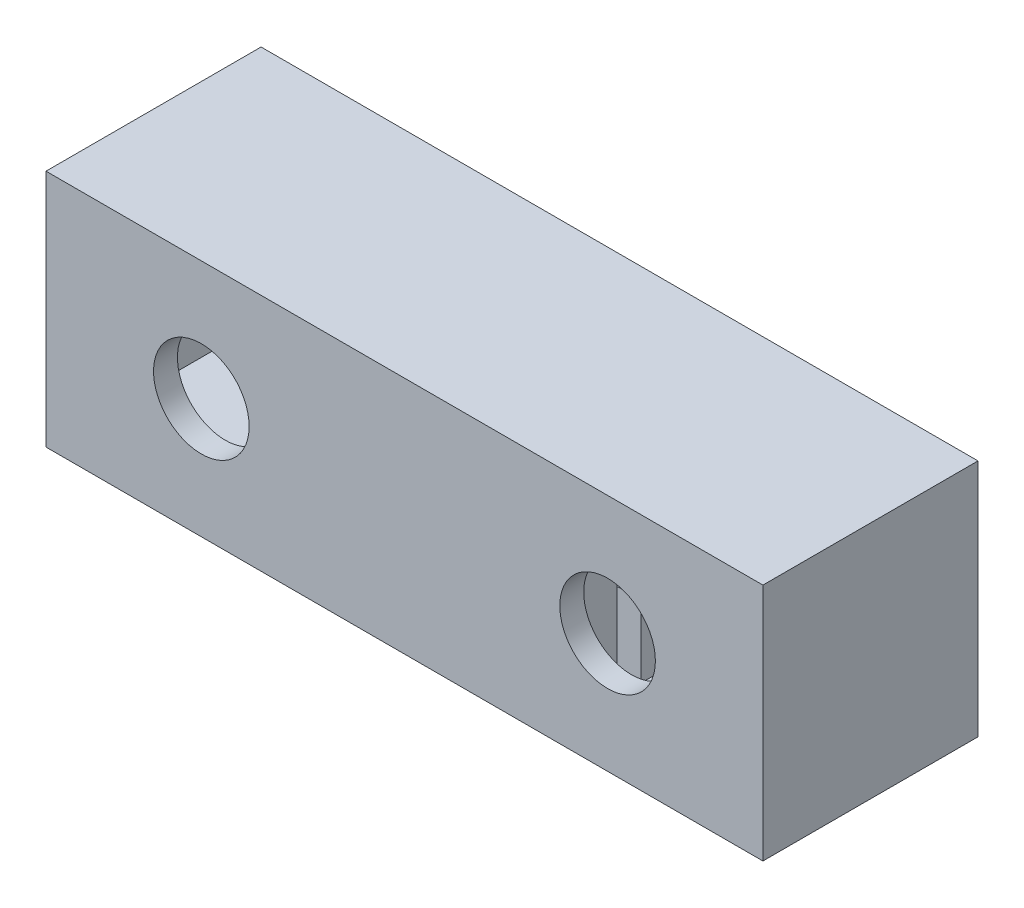
ISO-10303-21;
HEADER;
FILE_DESCRIPTION(('STEP AP214'),'2;1');
FILE_NAME('part.step','',(''),(''),'','','');
FILE_SCHEMA(('AUTOMOTIVE_DESIGN { 1 0 10303 214 1 1 1 1 }'));
ENDSEC;
DATA;
#1=APPLICATION_CONTEXT('core data for automotive mechanical design processes');
#2=APPLICATION_PROTOCOL_DEFINITION('international standard','automotive_design',2000,#1);
#3=PRODUCT_CONTEXT('',#1,'mechanical');
#4=PRODUCT('Part','Part','',(#3));
#5=PRODUCT_RELATED_PRODUCT_CATEGORY('part','',(#4));
#6=PRODUCT_DEFINITION_FORMATION('','',#4);
#7=PRODUCT_DEFINITION_CONTEXT('part definition',#1,'design');
#8=PRODUCT_DEFINITION('design','',#6,#7);
#9=PRODUCT_DEFINITION_SHAPE('','',#8);
#10=(LENGTH_UNIT() NAMED_UNIT(*) SI_UNIT(.MILLI.,.METRE.));
#11=(NAMED_UNIT(*) PLANE_ANGLE_UNIT() SI_UNIT($,.RADIAN.));
#12=(NAMED_UNIT(*) SI_UNIT($,.STERADIAN.) SOLID_ANGLE_UNIT());
#13=UNCERTAINTY_MEASURE_WITH_UNIT(LENGTH_MEASURE(1.E-05),#10,'distance_accuracy_value','');
#14=(GEOMETRIC_REPRESENTATION_CONTEXT(3) GLOBAL_UNCERTAINTY_ASSIGNED_CONTEXT((#13)) GLOBAL_UNIT_ASSIGNED_CONTEXT((#10,
#11,#12)) REPRESENTATION_CONTEXT('',''));
#15=CARTESIAN_POINT('',(0.,0.,0.));
#16=DIRECTION('',(0.,0.,1.));
#17=DIRECTION('',(1.,0.,0.));
#18=AXIS2_PLACEMENT_3D('',#15,#16,#17);
#19=CARTESIAN_POINT('',(0.,0.,-50.));
#20=DIRECTION('',(0.,0.,1.));
#21=DIRECTION('',(1.,0.,0.));
#22=AXIS2_PLACEMENT_3D('',#19,#20,#21);
#23=PLANE('',#22);
#24=DIRECTION('',(0.,1.,0.));
#25=VECTOR('',#24,1.);
#26=CARTESIAN_POINT('',(70.,-10.,-50.));
#27=LINE('',#26,#25);
#28=CARTESIAN_POINT('',(70.,-40.,-50.));
#29=VERTEX_POINT('',#28);
#30=CARTESIAN_POINT('',(70.,-10.,-50.));
#31=VERTEX_POINT('',#30);
#32=EDGE_CURVE('E269',#29,#31,#27,.T.);
#33=ORIENTED_EDGE('',*,*,#32,.F.);
#34=DIRECTION('',(-1.,0.,0.));
#35=VECTOR('',#34,1.);
#36=CARTESIAN_POINT('',(-140.,-40.,-50.));
#37=LINE('',#36,#35);
#38=CARTESIAN_POINT('',(-70.,-40.,-50.));
#39=VERTEX_POINT('',#38);
#40=EDGE_CURVE('E11',#29,#39,#37,.T.);
#41=ORIENTED_EDGE('',*,*,#40,.T.);
#42=DIRECTION('',(0.,-1.,0.));
#43=VECTOR('',#42,1.);
#44=CARTESIAN_POINT('',(-70.,-40.,-50.));
#45=LINE('',#44,#43);
#46=CARTESIAN_POINT('',(-70.,-10.,-50.));
#47=VERTEX_POINT('',#46);
#48=EDGE_CURVE('E231',#47,#39,#45,.T.);
#49=ORIENTED_EDGE('',*,*,#48,.F.);
#50=DIRECTION('',(1.,0.,0.));
#51=VECTOR('',#50,1.);
#52=CARTESIAN_POINT('',(60.,-10.,-50.));
#53=LINE('',#52,#51);
#54=EDGE_CURVE('E309',#47,#31,#53,.T.);
#55=ORIENTED_EDGE('',*,*,#54,.T.);
#56=EDGE_LOOP('',(#33,#41,#49,#55));
#57=FACE_BOUND('',#56,.T.);
#58=ADVANCED_FACE('F33',(#57),#23,.F.);
#59=CARTESIAN_POINT('',(-60.,40.,-50.));
#60=DIRECTION('',(1.,0.,0.));
#61=DIRECTION('',(0.,1.,0.));
#62=AXIS2_PLACEMENT_3D('',#59,#60,#61);
#63=PLANE('',#62);
#64=DIRECTION('',(0.,1.,0.));
#65=VECTOR('',#64,1.);
#66=CARTESIAN_POINT('',(-60.,-10.,-19.));
#67=LINE('',#66,#65);
#68=CARTESIAN_POINT('',(-60.,-40.,-19.));
#69=VERTEX_POINT('',#68);
#70=CARTESIAN_POINT('',(-60.,-10.,-19.));
#71=VERTEX_POINT('',#70);
#72=EDGE_CURVE('E230',#69,#71,#67,.T.);
#73=ORIENTED_EDGE('',*,*,#72,.F.);
#74=DIRECTION('',(0.,0.,1.));
#75=VECTOR('',#74,1.);
#76=CARTESIAN_POINT('',(-60.,-40.,-50.));
#77=LINE('',#76,#75);
#78=CARTESIAN_POINT('',(-60.,-40.,0.));
#79=VERTEX_POINT('',#78);
#80=EDGE_CURVE('E311',#69,#79,#77,.T.);
#81=ORIENTED_EDGE('',*,*,#80,.T.);
#82=DIRECTION('',(0.,1.,0.));
#83=VECTOR('',#82,1.);
#84=CARTESIAN_POINT('',(-60.,40.,0.));
#85=LINE('',#84,#83);
#86=CARTESIAN_POINT('',(-60.,40.,0.));
#87=VERTEX_POINT('',#86);
#88=EDGE_CURVE('E315',#79,#87,#85,.T.);
#89=ORIENTED_EDGE('',*,*,#88,.T.);
#90=DIRECTION('',(0.,0.,1.));
#91=VECTOR('',#90,1.);
#92=CARTESIAN_POINT('',(-60.,40.,-50.));
#93=LINE('',#92,#91);
#94=CARTESIAN_POINT('',(-60.,40.,-19.));
#95=VERTEX_POINT('',#94);
#96=EDGE_CURVE('E325',#95,#87,#93,.T.);
#97=ORIENTED_EDGE('',*,*,#96,.F.);
#98=DIRECTION('',(0.,1.,0.));
#99=VECTOR('',#98,1.);
#100=CARTESIAN_POINT('',(-60.,10.0000000000001,-19.));
#101=LINE('',#100,#99);
#102=CARTESIAN_POINT('',(-60.,10.0000000000001,-19.));
#103=VERTEX_POINT('',#102);
#104=EDGE_CURVE('E247',#103,#95,#101,.T.);
#105=ORIENTED_EDGE('',*,*,#104,.F.);
#106=DIRECTION('',(0.,1.,0.));
#107=VECTOR('',#106,1.);
#108=CARTESIAN_POINT('',(-60.,10.0000000000001,-19.));
#109=LINE('',#108,#107);
#110=EDGE_CURVE('E300',#71,#103,#109,.T.);
#111=ORIENTED_EDGE('',*,*,#110,.F.);
#112=EDGE_LOOP('',(#73,#81,#89,#97,#105,#111));
#113=FACE_BOUND('',#112,.T.);
#114=ADVANCED_FACE('F442',(#113),#63,.F.);
#115=CARTESIAN_POINT('',(60.,10.,-50.));
#116=DIRECTION('',(-1.,0.,0.));
#117=DIRECTION('',(0.,-1.,0.));
#118=AXIS2_PLACEMENT_3D('',#115,#116,#117);
#119=PLANE('',#118);
#120=DIRECTION('',(0.,-1.,0.));
#121=VECTOR('',#120,1.);
#122=CARTESIAN_POINT('',(60.,-40.,-19.));
#123=LINE('',#122,#121);
#124=CARTESIAN_POINT('',(60.,-10.,-19.));
#125=VERTEX_POINT('',#124);
#126=CARTESIAN_POINT('',(60.,-40.,-19.));
#127=VERTEX_POINT('',#126);
#128=EDGE_CURVE('E263',#125,#127,#123,.T.);
#129=ORIENTED_EDGE('',*,*,#128,.F.);
#130=DIRECTION('',(0.,-1.,0.));
#131=VECTOR('',#130,1.);
#132=CARTESIAN_POINT('',(60.,-10.,-19.));
#133=LINE('',#132,#131);
#134=CARTESIAN_POINT('',(60.,10.,-19.));
#135=VERTEX_POINT('',#134);
#136=EDGE_CURVE('E306',#135,#125,#133,.T.);
#137=ORIENTED_EDGE('',*,*,#136,.F.);
#138=DIRECTION('',(0.,-1.,0.));
#139=VECTOR('',#138,1.);
#140=CARTESIAN_POINT('',(60.,10.,-19.));
#141=LINE('',#140,#139);
#142=CARTESIAN_POINT('',(60.,40.,-19.));
#143=VERTEX_POINT('',#142);
#144=EDGE_CURVE('E280',#143,#135,#141,.T.);
#145=ORIENTED_EDGE('',*,*,#144,.F.);
#146=DIRECTION('',(0.,0.,1.));
#147=VECTOR('',#146,1.);
#148=CARTESIAN_POINT('',(60.,40.,-50.));
#149=LINE('',#148,#147);
#150=CARTESIAN_POINT('',(60.,40.,0.));
#151=VERTEX_POINT('',#150);
#152=EDGE_CURVE('E318',#143,#151,#149,.T.);
#153=ORIENTED_EDGE('',*,*,#152,.T.);
#154=DIRECTION('',(0.,-1.,0.));
#155=VECTOR('',#154,1.);
#156=CARTESIAN_POINT('',(60.,10.,0.));
#157=LINE('',#156,#155);
#158=CARTESIAN_POINT('',(60.,-40.,0.));
#159=VERTEX_POINT('',#158);
#160=EDGE_CURVE('E319',#151,#159,#157,.T.);
#161=ORIENTED_EDGE('',*,*,#160,.T.);
#162=DIRECTION('',(0.,0.,1.));
#163=VECTOR('',#162,1.);
#164=CARTESIAN_POINT('',(60.,-40.,-50.));
#165=LINE('',#164,#163);
#166=EDGE_CURVE('E313',#127,#159,#165,.T.);
#167=ORIENTED_EDGE('',*,*,#166,.F.);
#168=EDGE_LOOP('',(#129,#137,#145,#153,#161,#167));
#169=FACE_BOUND('',#168,.T.);
#170=ADVANCED_FACE('F417',(#169),#119,.F.);
#171=CARTESIAN_POINT('',(-140.,-40.,-50.));
#172=DIRECTION('',(0.,1.,0.));
#173=DIRECTION('',(0.,0.,1.));
#174=AXIS2_PLACEMENT_3D('',#171,#172,#173);
#175=PLANE('',#174);
#176=DIRECTION('',(0.,0.,-1.));
#177=VECTOR('',#176,1.);
#178=CARTESIAN_POINT('',(70.,-40.,-50.));
#179=LINE('',#178,#177);
#180=CARTESIAN_POINT('',(70.,-40.,-19.));
#181=VERTEX_POINT('',#180);
#182=EDGE_CURVE('E266',#181,#29,#179,.T.);
#183=ORIENTED_EDGE('',*,*,#182,.F.);
#184=DIRECTION('',(-1.,0.,0.));
#185=VECTOR('',#184,1.);
#186=CARTESIAN_POINT('',(70.,-40.,-19.));
#187=LINE('',#186,#185);
#188=EDGE_CURVE('E277',#181,#127,#187,.T.);
#189=ORIENTED_EDGE('',*,*,#188,.T.);
#190=ORIENTED_EDGE('',*,*,#166,.T.);
#191=DIRECTION('',(-1.,0.,0.));
#192=VECTOR('',#191,1.);
#193=CARTESIAN_POINT('',(-140.,-40.,0.));
#194=LINE('',#193,#192);
#195=CARTESIAN_POINT('',(140.,-40.,0.));
#196=VERTEX_POINT('',#195);
#197=EDGE_CURVE('E328',#196,#159,#194,.T.);
#198=ORIENTED_EDGE('',*,*,#197,.F.);
#199=DIRECTION('',(0.,0.,1.));
#200=VECTOR('',#199,1.);
#201=CARTESIAN_POINT('',(140.,-40.,-50.));
#202=LINE('',#201,#200);
#203=CARTESIAN_POINT('',(140.,-40.,-80.));
#204=VERTEX_POINT('',#203);
#205=EDGE_CURVE('E204',#204,#196,#202,.T.);
#206=ORIENTED_EDGE('',*,*,#205,.F.);
#207=DIRECTION('',(-1.,0.,0.));
#208=VECTOR('',#207,1.);
#209=CARTESIAN_POINT('',(-140.,-40.,-80.));
#210=LINE('',#209,#208);
#211=CARTESIAN_POINT('',(-140.,-40.,-80.));
#212=VERTEX_POINT('',#211);
#213=EDGE_CURVE('E200',#204,#212,#210,.T.);
#214=ORIENTED_EDGE('',*,*,#213,.T.);
#215=DIRECTION('',(0.,0.,1.));
#216=VECTOR('',#215,1.);
#217=CARTESIAN_POINT('',(-140.,-40.,-50.));
#218=LINE('',#217,#216);
#219=CARTESIAN_POINT('',(-140.,-40.,0.));
#220=VERTEX_POINT('',#219);
#221=EDGE_CURVE('E186',#212,#220,#218,.T.);
#222=ORIENTED_EDGE('',*,*,#221,.T.);
#223=EDGE_CURVE('E327',#79,#220,#194,.T.);
#224=ORIENTED_EDGE('',*,*,#223,.F.);
#225=ORIENTED_EDGE('',*,*,#80,.F.);
#226=DIRECTION('',(1.,0.,0.));
#227=VECTOR('',#226,1.);
#228=CARTESIAN_POINT('',(-70.,-40.,-19.));
#229=LINE('',#228,#227);
#230=CARTESIAN_POINT('',(-70.,-40.,-19.));
#231=VERTEX_POINT('',#230);
#232=EDGE_CURVE('E245',#231,#69,#229,.T.);
#233=ORIENTED_EDGE('',*,*,#232,.F.);
#234=DIRECTION('',(0.,0.,1.));
#235=VECTOR('',#234,1.);
#236=CARTESIAN_POINT('',(-70.,-40.,-19.));
#237=LINE('',#236,#235);
#238=EDGE_CURVE('E234',#39,#231,#237,.T.);
#239=ORIENTED_EDGE('',*,*,#238,.F.);
#240=ORIENTED_EDGE('',*,*,#40,.F.);
#241=EDGE_LOOP('',(#183,#189,#190,#198,#206,#214,#222,#224,#225,#233,#239,#240));
#242=FACE_BOUND('',#241,.T.);
#243=ADVANCED_FACE('F202',(#242),#175,.T.);
#244=CARTESIAN_POINT('',(140.,40.,-50.));
#245=DIRECTION('',(0.,-1.,0.));
#246=DIRECTION('',(0.,0.,-1.));
#247=AXIS2_PLACEMENT_3D('',#244,#245,#246);
#248=PLANE('',#247);
#249=ORIENTED_EDGE('',*,*,#152,.F.);
#250=DIRECTION('',(-1.,0.,0.));
#251=VECTOR('',#250,1.);
#252=CARTESIAN_POINT('',(70.,40.,-19.));
#253=LINE('',#252,#251);
#254=CARTESIAN_POINT('',(70.,40.,-19.));
#255=VERTEX_POINT('',#254);
#256=EDGE_CURVE('E57',#255,#143,#253,.T.);
#257=ORIENTED_EDGE('',*,*,#256,.F.);
#258=DIRECTION('',(0.,0.,1.));
#259=VECTOR('',#258,1.);
#260=CARTESIAN_POINT('',(70.,40.,-19.));
#261=LINE('',#260,#259);
#262=CARTESIAN_POINT('',(70.,40.,-50.));
#263=VERTEX_POINT('',#262);
#264=EDGE_CURVE('E287',#263,#255,#261,.T.);
#265=ORIENTED_EDGE('',*,*,#264,.F.);
#266=DIRECTION('',(1.,0.,0.));
#267=VECTOR('',#266,1.);
#268=CARTESIAN_POINT('',(140.,40.,-50.));
#269=LINE('',#268,#267);
#270=CARTESIAN_POINT('',(-70.,40.,-50.));
#271=VERTEX_POINT('',#270);
#272=EDGE_CURVE('E42',#271,#263,#269,.T.);
#273=ORIENTED_EDGE('',*,*,#272,.F.);
#274=DIRECTION('',(0.,0.,-1.));
#275=VECTOR('',#274,1.);
#276=CARTESIAN_POINT('',(-70.,40.,-19.));
#277=LINE('',#276,#275);
#278=CARTESIAN_POINT('',(-70.,40.,-19.));
#279=VERTEX_POINT('',#278);
#280=EDGE_CURVE('E50',#279,#271,#277,.T.);
#281=ORIENTED_EDGE('',*,*,#280,.F.);
#282=DIRECTION('',(1.,0.,0.));
#283=VECTOR('',#282,1.);
#284=CARTESIAN_POINT('',(-70.,40.,-19.));
#285=LINE('',#284,#283);
#286=EDGE_CURVE('E256',#279,#95,#285,.T.);
#287=ORIENTED_EDGE('',*,*,#286,.T.);
#288=ORIENTED_EDGE('',*,*,#96,.T.);
#289=DIRECTION('',(1.,0.,0.));
#290=VECTOR('',#289,1.);
#291=CARTESIAN_POINT('',(140.,40.,0.));
#292=LINE('',#291,#290);
#293=CARTESIAN_POINT('',(-140.,40.,0.));
#294=VERTEX_POINT('',#293);
#295=EDGE_CURVE('E333',#294,#87,#292,.T.);
#296=ORIENTED_EDGE('',*,*,#295,.F.);
#297=DIRECTION('',(0.,0.,1.));
#298=VECTOR('',#297,1.);
#299=CARTESIAN_POINT('',(-140.,40.,-50.));
#300=LINE('',#299,#298);
#301=CARTESIAN_POINT('',(-140.,40.,-80.));
#302=VERTEX_POINT('',#301);
#303=EDGE_CURVE('E197',#302,#294,#300,.T.);
#304=ORIENTED_EDGE('',*,*,#303,.F.);
#305=DIRECTION('',(1.,0.,0.));
#306=VECTOR('',#305,1.);
#307=CARTESIAN_POINT('',(140.,40.,-80.));
#308=LINE('',#307,#306);
#309=CARTESIAN_POINT('',(140.,40.,-80.));
#310=VERTEX_POINT('',#309);
#311=EDGE_CURVE('E211',#302,#310,#308,.T.);
#312=ORIENTED_EDGE('',*,*,#311,.T.);
#313=DIRECTION('',(0.,0.,1.));
#314=VECTOR('',#313,1.);
#315=CARTESIAN_POINT('',(140.,40.,-50.));
#316=LINE('',#315,#314);
#317=CARTESIAN_POINT('',(140.,40.,0.));
#318=VERTEX_POINT('',#317);
#319=EDGE_CURVE('E340',#310,#318,#316,.T.);
#320=ORIENTED_EDGE('',*,*,#319,.T.);
#321=EDGE_CURVE('E332',#151,#318,#292,.T.);
#322=ORIENTED_EDGE('',*,*,#321,.F.);
#323=EDGE_LOOP('',(#249,#257,#265,#273,#281,#287,#288,#296,#304,#312,#320,#322));
#324=FACE_BOUND('',#323,.T.);
#325=ADVANCED_FACE('F418',(#324),#248,.T.);
#326=CARTESIAN_POINT('',(0.,0.,0.));
#327=DIRECTION('',(0.,0.,1.));
#328=DIRECTION('',(1.,0.,0.));
#329=AXIS2_PLACEMENT_3D('',#326,#327,#328);
#330=PLANE('',#329);
#331=CARTESIAN_POINT('',(-85.,0.,0.));
#332=DIRECTION('',(0.,0.,1.));
#333=DIRECTION('',(1.,0.,0.));
#334=AXIS2_PLACEMENT_3D('',#331,#332,#333);
#335=CIRCLE('',#334,20.);
#336=CARTESIAN_POINT('',(-65.,0.,0.));
#337=VERTEX_POINT('',#336);
#338=EDGE_CURVE('E347',#337,#337,#335,.T.);
#339=ORIENTED_EDGE('',*,*,#338,.T.);
#340=EDGE_LOOP('',(#339));
#341=FACE_BOUND('',#340,.T.);
#342=ORIENTED_EDGE('',*,*,#88,.F.);
#343=ORIENTED_EDGE('',*,*,#223,.T.);
#344=DIRECTION('',(0.,1.,0.));
#345=VECTOR('',#344,1.);
#346=CARTESIAN_POINT('',(-140.,40.,0.));
#347=LINE('',#346,#345);
#348=EDGE_CURVE('E193',#220,#294,#347,.T.);
#349=ORIENTED_EDGE('',*,*,#348,.T.);
#350=ORIENTED_EDGE('',*,*,#295,.T.);
#351=EDGE_LOOP('',(#342,#343,#349,#350));
#352=FACE_BOUND('',#351,.T.);
#353=ADVANCED_FACE('F408',(#341,#352),#330,.F.);
#354=CARTESIAN_POINT('',(85.,0.,0.));
#355=DIRECTION('',(0.,0.,1.));
#356=DIRECTION('',(1.,0.,0.));
#357=AXIS2_PLACEMENT_3D('',#354,#355,#356);
#358=CIRCLE('',#357,20.);
#359=CARTESIAN_POINT('',(105.,0.,0.));
#360=VERTEX_POINT('',#359);
#361=EDGE_CURVE('E196',#360,#360,#358,.T.);
#362=ORIENTED_EDGE('',*,*,#361,.T.);
#363=EDGE_LOOP('',(#362));
#364=FACE_BOUND('',#363,.T.);
#365=ORIENTED_EDGE('',*,*,#197,.T.);
#366=ORIENTED_EDGE('',*,*,#160,.F.);
#367=ORIENTED_EDGE('',*,*,#321,.T.);
#368=DIRECTION('',(0.,-1.,0.));
#369=VECTOR('',#368,1.);
#370=CARTESIAN_POINT('',(140.,-40.,0.));
#371=LINE('',#370,#369);
#372=EDGE_CURVE('E336',#318,#196,#371,.T.);
#373=ORIENTED_EDGE('',*,*,#372,.T.);
#374=EDGE_LOOP('',(#365,#366,#367,#373));
#375=FACE_BOUND('',#374,.T.);
#376=ADVANCED_FACE('F404',(#364,#375),#330,.F.);
#377=CARTESIAN_POINT('',(60.,10.,-50.));
#378=DIRECTION('',(0.,1.,0.));
#379=DIRECTION('',(-1.,0.,0.));
#380=AXIS2_PLACEMENT_3D('',#377,#378,#379);
#381=PLANE('',#380);
#382=DIRECTION('',(1.,0.,0.));
#383=VECTOR('',#382,1.);
#384=CARTESIAN_POINT('',(60.,10.,-19.));
#385=LINE('',#384,#383);
#386=EDGE_CURVE('E303',#103,#135,#385,.T.);
#387=ORIENTED_EDGE('',*,*,#386,.F.);
#388=DIRECTION('',(1.,0.,0.));
#389=VECTOR('',#388,1.);
#390=CARTESIAN_POINT('',(-70.,10.0000000000001,-19.));
#391=LINE('',#390,#389);
#392=CARTESIAN_POINT('',(-70.,10.0000000000001,-19.));
#393=VERTEX_POINT('',#392);
#394=EDGE_CURVE('E260',#393,#103,#391,.T.);
#395=ORIENTED_EDGE('',*,*,#394,.F.);
#396=DIRECTION('',(0.,0.,1.));
#397=VECTOR('',#396,1.);
#398=CARTESIAN_POINT('',(-70.,10.0000000000001,-50.));
#399=LINE('',#398,#397);
#400=CARTESIAN_POINT('',(-70.,10.0000000000001,-50.));
#401=VERTEX_POINT('',#400);
#402=EDGE_CURVE('E252',#401,#393,#399,.T.);
#403=ORIENTED_EDGE('',*,*,#402,.F.);
#404=DIRECTION('',(-1.,0.,0.));
#405=VECTOR('',#404,1.);
#406=CARTESIAN_POINT('',(60.,10.,-50.));
#407=LINE('',#406,#405);
#408=CARTESIAN_POINT('',(70.,10.,-50.));
#409=VERTEX_POINT('',#408);
#410=EDGE_CURVE('E316',#409,#401,#407,.T.);
#411=ORIENTED_EDGE('',*,*,#410,.F.);
#412=DIRECTION('',(0.,0.,-1.));
#413=VECTOR('',#412,1.);
#414=CARTESIAN_POINT('',(70.,10.,-50.));
#415=LINE('',#414,#413);
#416=CARTESIAN_POINT('',(70.,10.,-19.));
#417=VERTEX_POINT('',#416);
#418=EDGE_CURVE('E281',#417,#409,#415,.T.);
#419=ORIENTED_EDGE('',*,*,#418,.F.);
#420=DIRECTION('',(-1.,0.,0.));
#421=VECTOR('',#420,1.);
#422=CARTESIAN_POINT('',(70.,10.,-19.));
#423=LINE('',#422,#421);
#424=EDGE_CURVE('E291',#417,#135,#423,.T.);
#425=ORIENTED_EDGE('',*,*,#424,.T.);
#426=EDGE_LOOP('',(#387,#395,#403,#411,#419,#425));
#427=FACE_BOUND('',#426,.T.);
#428=ADVANCED_FACE('F407',(#427),#381,.F.);
#429=CARTESIAN_POINT('',(60.,-10.,-50.));
#430=DIRECTION('',(0.,-1.,0.));
#431=DIRECTION('',(0.,0.,-1.));
#432=AXIS2_PLACEMENT_3D('',#429,#430,#431);
#433=PLANE('',#432);
#434=DIRECTION('',(-1.,0.,0.));
#435=VECTOR('',#434,1.);
#436=CARTESIAN_POINT('',(-60.,-10.,-19.));
#437=LINE('',#436,#435);
#438=EDGE_CURVE('E297',#125,#71,#437,.T.);
#439=ORIENTED_EDGE('',*,*,#438,.F.);
#440=DIRECTION('',(-1.,0.,0.));
#441=VECTOR('',#440,1.);
#442=CARTESIAN_POINT('',(70.,-10.,-19.));
#443=LINE('',#442,#441);
#444=CARTESIAN_POINT('',(70.,-10.,-19.));
#445=VERTEX_POINT('',#444);
#446=EDGE_CURVE('E274',#445,#125,#443,.T.);
#447=ORIENTED_EDGE('',*,*,#446,.F.);
#448=DIRECTION('',(0.,0.,1.));
#449=VECTOR('',#448,1.);
#450=CARTESIAN_POINT('',(70.,-10.,-19.));
#451=LINE('',#450,#449);
#452=EDGE_CURVE('E272',#31,#445,#451,.T.);
#453=ORIENTED_EDGE('',*,*,#452,.F.);
#454=ORIENTED_EDGE('',*,*,#54,.F.);
#455=DIRECTION('',(0.,0.,-1.));
#456=VECTOR('',#455,1.);
#457=CARTESIAN_POINT('',(-70.,-10.,-50.));
#458=LINE('',#457,#456);
#459=CARTESIAN_POINT('',(-70.,-10.,-19.));
#460=VERTEX_POINT('',#459);
#461=EDGE_CURVE('E238',#460,#47,#458,.T.);
#462=ORIENTED_EDGE('',*,*,#461,.F.);
#463=DIRECTION('',(1.,0.,0.));
#464=VECTOR('',#463,1.);
#465=CARTESIAN_POINT('',(-70.,-10.,-19.));
#466=LINE('',#465,#464);
#467=EDGE_CURVE('E241',#460,#71,#466,.T.);
#468=ORIENTED_EDGE('',*,*,#467,.T.);
#469=EDGE_LOOP('',(#439,#447,#453,#454,#462,#468));
#470=FACE_BOUND('',#469,.T.);
#471=ADVANCED_FACE('F391',(#470),#433,.F.);
#472=CARTESIAN_POINT('',(0.,0.,10.));
#473=DIRECTION('',(0.,0.,1.));
#474=DIRECTION('',(1.,0.,0.));
#475=AXIS2_PLACEMENT_3D('',#472,#473,#474);
#476=PLANE('',#475);
#477=CARTESIAN_POINT('',(-85.,0.,10.));
#478=DIRECTION('',(0.,0.,1.));
#479=DIRECTION('',(1.,0.,0.));
#480=AXIS2_PLACEMENT_3D('',#477,#478,#479);
#481=CIRCLE('',#480,20.);
#482=CARTESIAN_POINT('',(-65.,0.,10.));
#483=VERTEX_POINT('',#482);
#484=EDGE_CURVE('E350',#483,#483,#481,.T.);
#485=ORIENTED_EDGE('',*,*,#484,.F.);
#486=EDGE_LOOP('',(#485));
#487=FACE_BOUND('',#486,.T.);
#488=DIRECTION('',(0.,-1.,0.));
#489=VECTOR('',#488,1.);
#490=CARTESIAN_POINT('',(-150.,50.,10.));
#491=LINE('',#490,#489);
#492=CARTESIAN_POINT('',(-150.,50.,10.));
#493=VERTEX_POINT('',#492);
#494=CARTESIAN_POINT('',(-150.,-50.,10.));
#495=VERTEX_POINT('',#494);
#496=EDGE_CURVE('E353',#493,#495,#491,.T.);
#497=ORIENTED_EDGE('',*,*,#496,.T.);
#498=DIRECTION('',(1.,0.,0.));
#499=VECTOR('',#498,1.);
#500=CARTESIAN_POINT('',(-150.,-50.,10.));
#501=LINE('',#500,#499);
#502=CARTESIAN_POINT('',(150.,-50.,10.));
#503=VERTEX_POINT('',#502);
#504=EDGE_CURVE('E358',#495,#503,#501,.T.);
#505=ORIENTED_EDGE('',*,*,#504,.T.);
#506=DIRECTION('',(0.,1.,0.));
#507=VECTOR('',#506,1.);
#508=CARTESIAN_POINT('',(150.,50.,10.));
#509=LINE('',#508,#507);
#510=CARTESIAN_POINT('',(150.,50.,10.));
#511=VERTEX_POINT('',#510);
#512=EDGE_CURVE('E360',#503,#511,#509,.T.);
#513=ORIENTED_EDGE('',*,*,#512,.T.);
#514=DIRECTION('',(-1.,0.,0.));
#515=VECTOR('',#514,1.);
#516=CARTESIAN_POINT('',(-150.,50.,10.));
#517=LINE('',#516,#515);
#518=EDGE_CURVE('E362',#511,#493,#517,.T.);
#519=ORIENTED_EDGE('',*,*,#518,.T.);
#520=EDGE_LOOP('',(#497,#505,#513,#519));
#521=FACE_BOUND('',#520,.T.);
#522=CARTESIAN_POINT('',(85.,0.,10.));
#523=DIRECTION('',(0.,0.,1.));
#524=DIRECTION('',(1.,0.,0.));
#525=AXIS2_PLACEMENT_3D('',#522,#523,#524);
#526=CIRCLE('',#525,20.);
#527=CARTESIAN_POINT('',(105.,0.,10.));
#528=VERTEX_POINT('',#527);
#529=EDGE_CURVE('E344',#528,#528,#526,.T.);
#530=ORIENTED_EDGE('',*,*,#529,.F.);
#531=EDGE_LOOP('',(#530));
#532=FACE_BOUND('',#531,.T.);
#533=ADVANCED_FACE('F388',(#487,#521,#532),#476,.T.);
#534=CARTESIAN_POINT('',(-150.,50.,10.));
#535=DIRECTION('',(1.,0.,0.));
#536=DIRECTION('',(0.,0.,-1.));
#537=AXIS2_PLACEMENT_3D('',#534,#535,#536);
#538=PLANE('',#537);
#539=DIRECTION('',(0.,0.,-1.));
#540=VECTOR('',#539,1.);
#541=CARTESIAN_POINT('',(-150.,50.,10.));
#542=LINE('',#541,#540);
#543=CARTESIAN_POINT('',(-150.,50.,-80.));
#544=VERTEX_POINT('',#543);
#545=EDGE_CURVE('E364',#493,#544,#542,.T.);
#546=ORIENTED_EDGE('',*,*,#545,.T.);
#547=DIRECTION('',(0.,1.,0.));
#548=VECTOR('',#547,1.);
#549=CARTESIAN_POINT('',(-150.,50.,-80.));
#550=LINE('',#549,#548);
#551=CARTESIAN_POINT('',(-150.,-50.,-80.));
#552=VERTEX_POINT('',#551);
#553=EDGE_CURVE('E224',#552,#544,#550,.T.);
#554=ORIENTED_EDGE('',*,*,#553,.F.);
#555=DIRECTION('',(0.,0.,-1.));
#556=VECTOR('',#555,1.);
#557=CARTESIAN_POINT('',(-150.,-50.,10.));
#558=LINE('',#557,#556);
#559=EDGE_CURVE('E37',#495,#552,#558,.T.);
#560=ORIENTED_EDGE('',*,*,#559,.F.);
#561=ORIENTED_EDGE('',*,*,#496,.F.);
#562=EDGE_LOOP('',(#546,#554,#560,#561));
#563=FACE_BOUND('',#562,.T.);
#564=ADVANCED_FACE('F35',(#563),#538,.F.);
#565=CARTESIAN_POINT('',(-150.,-50.,10.));
#566=DIRECTION('',(0.,1.,0.));
#567=DIRECTION('',(-1.,0.,0.));
#568=AXIS2_PLACEMENT_3D('',#565,#566,#567);
#569=PLANE('',#568);
#570=ORIENTED_EDGE('',*,*,#559,.T.);
#571=DIRECTION('',(-1.,0.,0.));
#572=VECTOR('',#571,1.);
#573=CARTESIAN_POINT('',(-150.,-50.,-80.));
#574=LINE('',#573,#572);
#575=CARTESIAN_POINT('',(150.,-50.,-80.));
#576=VERTEX_POINT('',#575);
#577=EDGE_CURVE('E221',#576,#552,#574,.T.);
#578=ORIENTED_EDGE('',*,*,#577,.F.);
#579=DIRECTION('',(0.,0.,-1.));
#580=VECTOR('',#579,1.);
#581=CARTESIAN_POINT('',(150.,-50.,10.));
#582=LINE('',#581,#580);
#583=EDGE_CURVE('E367',#503,#576,#582,.T.);
#584=ORIENTED_EDGE('',*,*,#583,.F.);
#585=ORIENTED_EDGE('',*,*,#504,.F.);
#586=EDGE_LOOP('',(#570,#578,#584,#585));
#587=FACE_BOUND('',#586,.T.);
#588=ADVANCED_FACE('F375',(#587),#569,.F.);
#589=CARTESIAN_POINT('',(150.,50.,10.));
#590=DIRECTION('',(-1.,0.,0.));
#591=DIRECTION('',(0.,0.,1.));
#592=AXIS2_PLACEMENT_3D('',#589,#590,#591);
#593=PLANE('',#592);
#594=ORIENTED_EDGE('',*,*,#583,.T.);
#595=DIRECTION('',(0.,-1.,0.));
#596=VECTOR('',#595,1.);
#597=CARTESIAN_POINT('',(150.,-50.,-80.));
#598=LINE('',#597,#596);
#599=CARTESIAN_POINT('',(150.,50.,-80.));
#600=VERTEX_POINT('',#599);
#601=EDGE_CURVE('E216',#600,#576,#598,.T.);
#602=ORIENTED_EDGE('',*,*,#601,.F.);
#603=DIRECTION('',(0.,0.,-1.));
#604=VECTOR('',#603,1.);
#605=CARTESIAN_POINT('',(150.,50.,10.));
#606=LINE('',#605,#604);
#607=EDGE_CURVE('E366',#511,#600,#606,.T.);
#608=ORIENTED_EDGE('',*,*,#607,.F.);
#609=ORIENTED_EDGE('',*,*,#512,.F.);
#610=EDGE_LOOP('',(#594,#602,#608,#609));
#611=FACE_BOUND('',#610,.T.);
#612=ADVANCED_FACE('F386',(#611),#593,.F.);
#613=CARTESIAN_POINT('',(-150.,50.,10.));
#614=DIRECTION('',(0.,-1.,0.));
#615=DIRECTION('',(0.,0.,-1.));
#616=AXIS2_PLACEMENT_3D('',#613,#614,#615);
#617=PLANE('',#616);
#618=ORIENTED_EDGE('',*,*,#607,.T.);
#619=DIRECTION('',(1.,0.,0.));
#620=VECTOR('',#619,1.);
#621=CARTESIAN_POINT('',(150.,50.,-80.));
#622=LINE('',#621,#620);
#623=EDGE_CURVE('E227',#544,#600,#622,.T.);
#624=ORIENTED_EDGE('',*,*,#623,.F.);
#625=ORIENTED_EDGE('',*,*,#545,.F.);
#626=ORIENTED_EDGE('',*,*,#518,.F.);
#627=EDGE_LOOP('',(#618,#624,#625,#626));
#628=FACE_BOUND('',#627,.T.);
#629=ADVANCED_FACE('F384',(#628),#617,.F.);
#630=CARTESIAN_POINT('',(-85.,0.,10.));
#631=DIRECTION('',(0.,0.,-1.));
#632=DIRECTION('',(-1.,0.,0.));
#633=AXIS2_PLACEMENT_3D('',#630,#631,#632);
#634=CYLINDRICAL_SURFACE('',#633,20.);
#635=ORIENTED_EDGE('',*,*,#484,.T.);
#636=EDGE_LOOP('',(#635));
#637=FACE_BOUND('',#636,.T.);
#638=ORIENTED_EDGE('',*,*,#338,.F.);
#639=EDGE_LOOP('',(#638));
#640=FACE_BOUND('',#639,.T.);
#641=ADVANCED_FACE('F400',(#637,#640),#634,.F.);
#642=CARTESIAN_POINT('',(85.,0.,10.));
#643=DIRECTION('',(0.,0.,-1.));
#644=DIRECTION('',(-1.,0.,0.));
#645=AXIS2_PLACEMENT_3D('',#642,#643,#644);
#646=CYLINDRICAL_SURFACE('',#645,20.);
#647=ORIENTED_EDGE('',*,*,#529,.T.);
#648=EDGE_LOOP('',(#647));
#649=FACE_BOUND('',#648,.T.);
#650=ORIENTED_EDGE('',*,*,#361,.F.);
#651=EDGE_LOOP('',(#650));
#652=FACE_BOUND('',#651,.T.);
#653=ADVANCED_FACE('F396',(#649,#652),#646,.F.);
#654=DIRECTION('',(0.,-1.,0.));
#655=VECTOR('',#654,1.);
#656=CARTESIAN_POINT('',(-70.,40.,-50.));
#657=LINE('',#656,#655);
#658=EDGE_CURVE('E249',#271,#401,#657,.T.);
#659=ORIENTED_EDGE('',*,*,#658,.F.);
#660=ORIENTED_EDGE('',*,*,#272,.T.);
#661=DIRECTION('',(0.,1.,0.));
#662=VECTOR('',#661,1.);
#663=CARTESIAN_POINT('',(70.,40.,-50.));
#664=LINE('',#663,#662);
#665=EDGE_CURVE('E284',#409,#263,#664,.T.);
#666=ORIENTED_EDGE('',*,*,#665,.F.);
#667=ORIENTED_EDGE('',*,*,#410,.T.);
#668=EDGE_LOOP('',(#659,#660,#666,#667));
#669=FACE_BOUND('',#668,.T.);
#670=ADVANCED_FACE('F399',(#669),#23,.F.);
#671=CARTESIAN_POINT('',(-140.,40.,-50.));
#672=DIRECTION('',(1.,0.,0.));
#673=DIRECTION('',(0.,0.,-1.));
#674=AXIS2_PLACEMENT_3D('',#671,#672,#673);
#675=PLANE('',#674);
#676=ORIENTED_EDGE('',*,*,#348,.F.);
#677=ORIENTED_EDGE('',*,*,#221,.F.);
#678=DIRECTION('',(0.,1.,0.));
#679=VECTOR('',#678,1.);
#680=CARTESIAN_POINT('',(-140.,40.,-80.));
#681=LINE('',#680,#679);
#682=EDGE_CURVE('E190',#212,#302,#681,.T.);
#683=ORIENTED_EDGE('',*,*,#682,.T.);
#684=ORIENTED_EDGE('',*,*,#303,.T.);
#685=EDGE_LOOP('',(#676,#677,#683,#684));
#686=FACE_BOUND('',#685,.T.);
#687=ADVANCED_FACE('F188',(#686),#675,.T.);
#688=CARTESIAN_POINT('',(140.,-40.,-50.));
#689=DIRECTION('',(-1.,0.,0.));
#690=DIRECTION('',(0.,0.,1.));
#691=AXIS2_PLACEMENT_3D('',#688,#689,#690);
#692=PLANE('',#691);
#693=ORIENTED_EDGE('',*,*,#372,.F.);
#694=ORIENTED_EDGE('',*,*,#319,.F.);
#695=DIRECTION('',(0.,-1.,0.));
#696=VECTOR('',#695,1.);
#697=CARTESIAN_POINT('',(140.,-40.,-80.));
#698=LINE('',#697,#696);
#699=EDGE_CURVE('E213',#310,#204,#698,.T.);
#700=ORIENTED_EDGE('',*,*,#699,.T.);
#701=ORIENTED_EDGE('',*,*,#205,.T.);
#702=EDGE_LOOP('',(#693,#694,#700,#701));
#703=FACE_BOUND('',#702,.T.);
#704=ADVANCED_FACE('F488',(#703),#692,.T.);
#705=CARTESIAN_POINT('',(0.,0.,-19.));
#706=DIRECTION('',(0.,0.,1.));
#707=DIRECTION('',(1.,0.,0.));
#708=AXIS2_PLACEMENT_3D('',#705,#706,#707);
#709=PLANE('',#708);
#710=ORIENTED_EDGE('',*,*,#438,.T.);
#711=ORIENTED_EDGE('',*,*,#110,.T.);
#712=ORIENTED_EDGE('',*,*,#386,.T.);
#713=ORIENTED_EDGE('',*,*,#136,.T.);
#714=EDGE_LOOP('',(#710,#711,#712,#713));
#715=FACE_BOUND('',#714,.T.);
#716=ADVANCED_FACE('F466',(#715),#709,.F.);
#717=CARTESIAN_POINT('',(70.,10.,-19.));
#718=DIRECTION('',(0.,0.,-1.));
#719=DIRECTION('',(-1.,0.,0.));
#720=AXIS2_PLACEMENT_3D('',#717,#718,#719);
#721=PLANE('',#720);
#722=ORIENTED_EDGE('',*,*,#144,.T.);
#723=ORIENTED_EDGE('',*,*,#424,.F.);
#724=DIRECTION('',(0.,-1.,0.));
#725=VECTOR('',#724,1.);
#726=CARTESIAN_POINT('',(70.,10.,-19.));
#727=LINE('',#726,#725);
#728=EDGE_CURVE('E289',#255,#417,#727,.T.);
#729=ORIENTED_EDGE('',*,*,#728,.F.);
#730=ORIENTED_EDGE('',*,*,#256,.T.);
#731=EDGE_LOOP('',(#722,#723,#729,#730));
#732=FACE_BOUND('',#731,.T.);
#733=ADVANCED_FACE('F421',(#732),#721,.F.);
#734=CARTESIAN_POINT('',(70.,0.,0.));
#735=DIRECTION('',(-1.,0.,0.));
#736=DIRECTION('',(0.,-1.,0.));
#737=AXIS2_PLACEMENT_3D('',#734,#735,#736);
#738=PLANE('',#737);
#739=ORIENTED_EDGE('',*,*,#418,.T.);
#740=ORIENTED_EDGE('',*,*,#665,.T.);
#741=ORIENTED_EDGE('',*,*,#264,.T.);
#742=ORIENTED_EDGE('',*,*,#728,.T.);
#743=EDGE_LOOP('',(#739,#740,#741,#742));
#744=FACE_BOUND('',#743,.T.);
#745=ADVANCED_FACE('F425',(#744),#738,.F.);
#746=CARTESIAN_POINT('',(70.,-40.,-19.));
#747=DIRECTION('',(0.,0.,-1.));
#748=DIRECTION('',(-1.,0.,0.));
#749=AXIS2_PLACEMENT_3D('',#746,#747,#748);
#750=PLANE('',#749);
#751=ORIENTED_EDGE('',*,*,#128,.T.);
#752=ORIENTED_EDGE('',*,*,#188,.F.);
#753=DIRECTION('',(0.,-1.,0.));
#754=VECTOR('',#753,1.);
#755=CARTESIAN_POINT('',(70.,-40.,-19.));
#756=LINE('',#755,#754);
#757=EDGE_CURVE('E264',#445,#181,#756,.T.);
#758=ORIENTED_EDGE('',*,*,#757,.F.);
#759=ORIENTED_EDGE('',*,*,#446,.T.);
#760=EDGE_LOOP('',(#751,#752,#758,#759));
#761=FACE_BOUND('',#760,.T.);
#762=ADVANCED_FACE('F463',(#761),#750,.F.);
#763=CARTESIAN_POINT('',(70.,0.,0.));
#764=DIRECTION('',(-1.,0.,0.));
#765=DIRECTION('',(0.,-1.,0.));
#766=AXIS2_PLACEMENT_3D('',#763,#764,#765);
#767=PLANE('',#766);
#768=ORIENTED_EDGE('',*,*,#757,.T.);
#769=ORIENTED_EDGE('',*,*,#182,.T.);
#770=ORIENTED_EDGE('',*,*,#32,.T.);
#771=ORIENTED_EDGE('',*,*,#452,.T.);
#772=EDGE_LOOP('',(#768,#769,#770,#771));
#773=FACE_BOUND('',#772,.T.);
#774=ADVANCED_FACE('F458',(#773),#767,.F.);
#775=CARTESIAN_POINT('',(-70.,10.0000000000001,-19.));
#776=DIRECTION('',(0.,0.,-1.));
#777=DIRECTION('',(-1.,0.,0.));
#778=AXIS2_PLACEMENT_3D('',#775,#776,#777);
#779=PLANE('',#778);
#780=ORIENTED_EDGE('',*,*,#104,.T.);
#781=ORIENTED_EDGE('',*,*,#286,.F.);
#782=DIRECTION('',(0.,1.,0.));
#783=VECTOR('',#782,1.);
#784=CARTESIAN_POINT('',(-70.,10.0000000000001,-19.));
#785=LINE('',#784,#783);
#786=EDGE_CURVE('E254',#393,#279,#785,.T.);
#787=ORIENTED_EDGE('',*,*,#786,.F.);
#788=ORIENTED_EDGE('',*,*,#394,.T.);
#789=EDGE_LOOP('',(#780,#781,#787,#788));
#790=FACE_BOUND('',#789,.T.);
#791=ADVANCED_FACE('F436',(#790),#779,.F.);
#792=CARTESIAN_POINT('',(-70.,0.,0.));
#793=DIRECTION('',(-1.,0.,0.));
#794=DIRECTION('',(0.,-1.,0.));
#795=AXIS2_PLACEMENT_3D('',#792,#793,#794);
#796=PLANE('',#795);
#797=ORIENTED_EDGE('',*,*,#280,.T.);
#798=ORIENTED_EDGE('',*,*,#658,.T.);
#799=ORIENTED_EDGE('',*,*,#402,.T.);
#800=ORIENTED_EDGE('',*,*,#786,.T.);
#801=EDGE_LOOP('',(#797,#798,#799,#800));
#802=FACE_BOUND('',#801,.T.);
#803=ADVANCED_FACE('F431',(#802),#796,.T.);
#804=CARTESIAN_POINT('',(-70.,-10.,-19.));
#805=DIRECTION('',(0.,0.,-1.));
#806=DIRECTION('',(-1.,0.,0.));
#807=AXIS2_PLACEMENT_3D('',#804,#805,#806);
#808=PLANE('',#807);
#809=ORIENTED_EDGE('',*,*,#72,.T.);
#810=ORIENTED_EDGE('',*,*,#467,.F.);
#811=DIRECTION('',(0.,1.,0.));
#812=VECTOR('',#811,1.);
#813=CARTESIAN_POINT('',(-70.,-10.,-19.));
#814=LINE('',#813,#812);
#815=EDGE_CURVE('E236',#231,#460,#814,.T.);
#816=ORIENTED_EDGE('',*,*,#815,.F.);
#817=ORIENTED_EDGE('',*,*,#232,.T.);
#818=EDGE_LOOP('',(#809,#810,#816,#817));
#819=FACE_BOUND('',#818,.T.);
#820=ADVANCED_FACE('F449',(#819),#808,.F.);
#821=CARTESIAN_POINT('',(-70.,0.,0.));
#822=DIRECTION('',(1.,0.,0.));
#823=DIRECTION('',(0.,1.,0.));
#824=AXIS2_PLACEMENT_3D('',#821,#822,#823);
#825=PLANE('',#824);
#826=ORIENTED_EDGE('',*,*,#48,.T.);
#827=ORIENTED_EDGE('',*,*,#238,.T.);
#828=ORIENTED_EDGE('',*,*,#815,.T.);
#829=ORIENTED_EDGE('',*,*,#461,.T.);
#830=EDGE_LOOP('',(#826,#827,#828,#829));
#831=FACE_BOUND('',#830,.T.);
#832=ADVANCED_FACE('F453',(#831),#825,.F.);
#833=CARTESIAN_POINT('',(0.,0.,-80.));
#834=DIRECTION('',(0.,0.,1.));
#835=DIRECTION('',(1.,0.,0.));
#836=AXIS2_PLACEMENT_3D('',#833,#834,#835);
#837=PLANE('',#836);
#838=ORIENTED_EDGE('',*,*,#601,.T.);
#839=ORIENTED_EDGE('',*,*,#577,.T.);
#840=ORIENTED_EDGE('',*,*,#553,.T.);
#841=ORIENTED_EDGE('',*,*,#623,.T.);
#842=EDGE_LOOP('',(#838,#839,#840,#841));
#843=FACE_BOUND('',#842,.T.);
#844=ORIENTED_EDGE('',*,*,#213,.F.);
#845=ORIENTED_EDGE('',*,*,#699,.F.);
#846=ORIENTED_EDGE('',*,*,#311,.F.);
#847=ORIENTED_EDGE('',*,*,#682,.F.);
#848=EDGE_LOOP('',(#844,#845,#846,#847));
#849=FACE_BOUND('',#848,.T.);
#850=ADVANCED_FACE('F209',(#843,#849),#837,.F.);
#851=CLOSED_SHELL('',(#58,#114,#170,#243,#325,#353,#376,#428,#471,#533,#564,#588,#612,#629,#641,
#653,#670,#687,#704,#716,#733,#745,#762,#774,#791,#803,#820,#832,#850));
#852=MANIFOLD_SOLID_BREP('B2',#851);
#853=ADVANCED_BREP_SHAPE_REPRESENTATION('',(#18,#852),#14);
#854=SHAPE_DEFINITION_REPRESENTATION(#9,#853);
ENDSEC;
END-ISO-10303-21;
